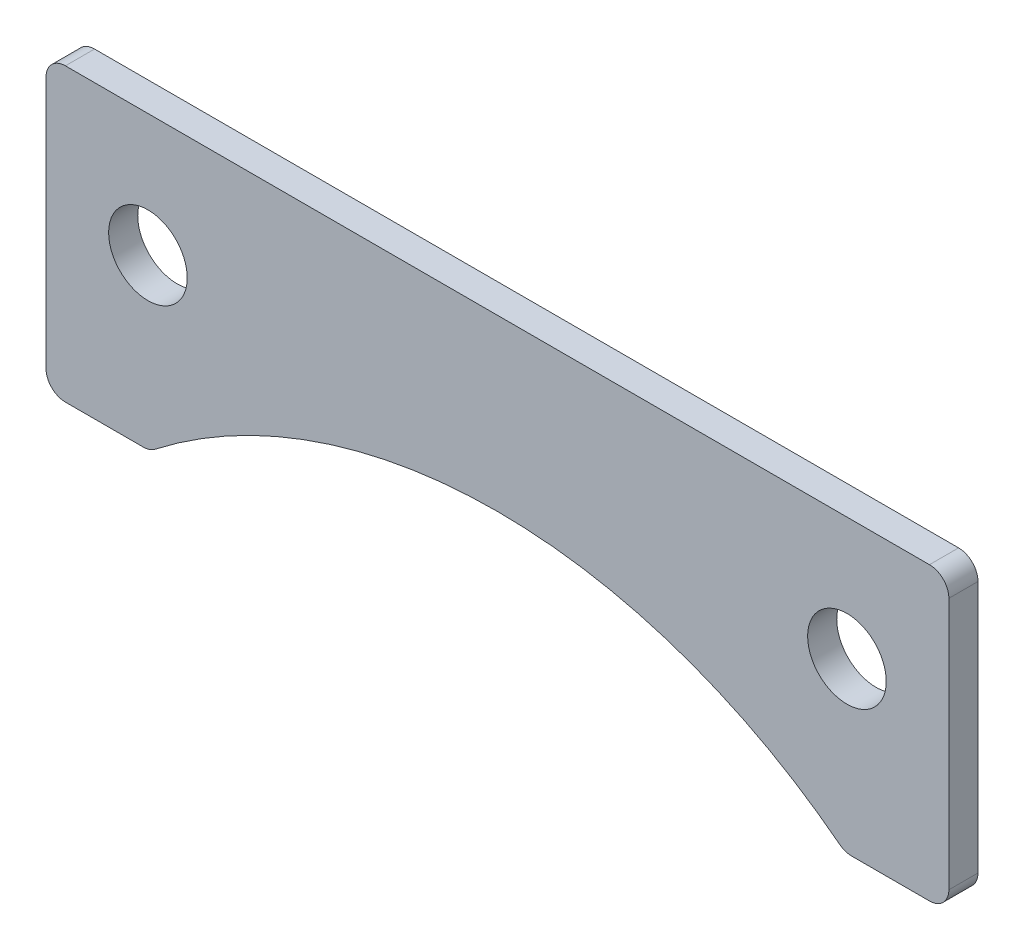
ISO-10303-21;
HEADER;
FILE_DESCRIPTION(('STEP AP214'),'2;1');
FILE_NAME('part.step','',(''),(''),'','','');
FILE_SCHEMA(('AUTOMOTIVE_DESIGN { 1 0 10303 214 1 1 1 1 }'));
ENDSEC;
DATA;
#1=APPLICATION_CONTEXT('core data for automotive mechanical design processes');
#2=APPLICATION_PROTOCOL_DEFINITION('international standard','automotive_design',2000,#1);
#3=PRODUCT_CONTEXT('',#1,'mechanical');
#4=PRODUCT('Part','Part','',(#3));
#5=PRODUCT_RELATED_PRODUCT_CATEGORY('part','',(#4));
#6=PRODUCT_DEFINITION_FORMATION('','',#4);
#7=PRODUCT_DEFINITION_CONTEXT('part definition',#1,'design');
#8=PRODUCT_DEFINITION('design','',#6,#7);
#9=PRODUCT_DEFINITION_SHAPE('','',#8);
#10=(LENGTH_UNIT() NAMED_UNIT(*) SI_UNIT(.MILLI.,.METRE.));
#11=(NAMED_UNIT(*) PLANE_ANGLE_UNIT() SI_UNIT($,.RADIAN.));
#12=(NAMED_UNIT(*) SI_UNIT($,.STERADIAN.) SOLID_ANGLE_UNIT());
#13=UNCERTAINTY_MEASURE_WITH_UNIT(LENGTH_MEASURE(1.E-05),#10,'distance_accuracy_value','');
#14=(GEOMETRIC_REPRESENTATION_CONTEXT(3) GLOBAL_UNCERTAINTY_ASSIGNED_CONTEXT((#13)) GLOBAL_UNIT_ASSIGNED_CONTEXT((#10,
#11,#12)) REPRESENTATION_CONTEXT('',''));
#15=CARTESIAN_POINT('',(0.,0.,0.));
#16=DIRECTION('',(0.,0.,1.));
#17=DIRECTION('',(1.,0.,0.));
#18=AXIS2_PLACEMENT_3D('',#15,#16,#17);
#19=CARTESIAN_POINT('',(0.,17.9426377775834,0.));
#20=DIRECTION('',(0.,0.,1.));
#21=DIRECTION('',(1.,0.,0.));
#22=AXIS2_PLACEMENT_3D('',#19,#20,#21);
#23=PLANE('',#22);
#24=CARTESIAN_POINT('',(36.,17.3538290724796,0.));
#25=DIRECTION('',(0.,0.,1.));
#26=DIRECTION('',(1.,0.,0.));
#27=AXIS2_PLACEMENT_3D('',#24,#25,#26);
#28=CIRCLE('',#27,4.05);
#29=CARTESIAN_POINT('',(31.95,17.3538290724796,0.));
#30=VERTEX_POINT('',#29);
#31=EDGE_CURVE('E40',#30,#30,#28,.T.);
#32=ORIENTED_EDGE('',*,*,#31,.T.);
#33=EDGE_LOOP('',(#32));
#34=FACE_BOUND('',#33,.T.);
#35=CARTESIAN_POINT('',(-36.,17.3538290724796,0.));
#36=DIRECTION('',(0.,0.,1.));
#37=DIRECTION('',(1.,0.,0.));
#38=AXIS2_PLACEMENT_3D('',#35,#36,#37);
#39=CIRCLE('',#38,4.05);
#40=CARTESIAN_POINT('',(-40.05,17.3538290724796,0.));
#41=VERTEX_POINT('',#40);
#42=EDGE_CURVE('E201',#41,#41,#39,.T.);
#43=ORIENTED_EDGE('',*,*,#42,.T.);
#44=EDGE_LOOP('',(#43));
#45=FACE_BOUND('',#44,.T.);
#46=CARTESIAN_POINT('',(-44.5,2.,0.));
#47=DIRECTION('',(0.,0.,1.));
#48=DIRECTION('',(-0.707106781186546,-0.707106781186549,0.));
#49=AXIS2_PLACEMENT_3D('',#46,#47,#48);
#50=CIRCLE('',#49,2.);
#51=CARTESIAN_POINT('',(-46.5,2.,0.));
#52=VERTEX_POINT('',#51);
#53=CARTESIAN_POINT('',(-44.5,0.,0.));
#54=VERTEX_POINT('',#53);
#55=EDGE_CURVE('E169',#52,#54,#50,.T.);
#56=ORIENTED_EDGE('',*,*,#55,.F.);
#57=DIRECTION('',(0.,1.,0.));
#58=VECTOR('',#57,1.);
#59=CARTESIAN_POINT('',(-46.5,0.,0.));
#60=LINE('',#59,#58);
#61=CARTESIAN_POINT('',(-46.5,28.,0.));
#62=VERTEX_POINT('',#61);
#63=EDGE_CURVE('E164',#52,#62,#60,.T.);
#64=ORIENTED_EDGE('',*,*,#63,.T.);
#65=CARTESIAN_POINT('',(-44.5,28.,0.));
#66=DIRECTION('',(0.,0.,1.));
#67=DIRECTION('',(-0.707106781186546,0.707106781186549,0.));
#68=AXIS2_PLACEMENT_3D('',#65,#66,#67);
#69=CIRCLE('',#68,2.);
#70=CARTESIAN_POINT('',(-44.5,30.,0.));
#71=VERTEX_POINT('',#70);
#72=EDGE_CURVE('E260',#71,#62,#69,.T.);
#73=ORIENTED_EDGE('',*,*,#72,.F.);
#74=DIRECTION('',(1.,0.,0.));
#75=VECTOR('',#74,1.);
#76=CARTESIAN_POINT('',(-46.5,30.,0.));
#77=LINE('',#76,#75);
#78=CARTESIAN_POINT('',(44.5,30.,0.));
#79=VERTEX_POINT('',#78);
#80=EDGE_CURVE('E270',#71,#79,#77,.T.);
#81=ORIENTED_EDGE('',*,*,#80,.T.);
#82=CARTESIAN_POINT('',(44.5,28.,0.));
#83=DIRECTION('',(0.,0.,1.));
#84=DIRECTION('',(0.707106781186546,0.707106781186549,0.));
#85=AXIS2_PLACEMENT_3D('',#82,#83,#84);
#86=CIRCLE('',#85,2.);
#87=CARTESIAN_POINT('',(46.5,28.,0.));
#88=VERTEX_POINT('',#87);
#89=EDGE_CURVE('E248',#88,#79,#86,.T.);
#90=ORIENTED_EDGE('',*,*,#89,.F.);
#91=DIRECTION('',(0.,-1.,0.));
#92=VECTOR('',#91,1.);
#93=CARTESIAN_POINT('',(46.5,30.,0.));
#94=LINE('',#93,#92);
#95=CARTESIAN_POINT('',(46.5,2.,0.));
#96=VERTEX_POINT('',#95);
#97=EDGE_CURVE('E243',#88,#96,#94,.T.);
#98=ORIENTED_EDGE('',*,*,#97,.T.);
#99=CARTESIAN_POINT('',(44.5,2.,0.));
#100=DIRECTION('',(0.,0.,1.));
#101=DIRECTION('',(0.707106781186549,-0.707106781186546,0.));
#102=AXIS2_PLACEMENT_3D('',#99,#100,#101);
#103=CIRCLE('',#102,2.);
#104=CARTESIAN_POINT('',(44.5,0.,0.));
#105=VERTEX_POINT('',#104);
#106=EDGE_CURVE('E241',#105,#96,#103,.T.);
#107=ORIENTED_EDGE('',*,*,#106,.F.);
#108=DIRECTION('',(-1.,0.,0.));
#109=VECTOR('',#108,1.);
#110=CARTESIAN_POINT('',(46.5,0.,0.));
#111=LINE('',#110,#109);
#112=CARTESIAN_POINT('',(36.4862987983161,0.,0.));
#113=VERTEX_POINT('',#112);
#114=EDGE_CURVE('E28',#105,#113,#111,.T.);
#115=ORIENTED_EDGE('',*,*,#114,.T.);
#116=CARTESIAN_POINT('',(36.4862987983161,2.,0.));
#117=DIRECTION('',(0.,0.,1.));
#118=DIRECTION('',(-0.324101861776083,-0.946022189588213,0.));
#119=AXIS2_PLACEMENT_3D('',#116,#117,#118);
#120=CIRCLE('',#119,2.);
#121=CARTESIAN_POINT('',(35.259868586608,0.420168067226889,0.));
#122=VERTEX_POINT('',#121);
#123=EDGE_CURVE('E259',#122,#113,#120,.T.);
#124=ORIENTED_EDGE('',*,*,#123,.F.);
#125=CARTESIAN_POINT('',(0.,-45.,0.));
#126=DIRECTION('',(0.,0.,1.));
#127=DIRECTION('',(0.622513959272885,0.782608695652174,0.));
#128=AXIS2_PLACEMENT_3D('',#125,#126,#127);
#129=CIRCLE('',#128,57.5);
#130=CARTESIAN_POINT('',(-35.2598685866079,0.420168067226898,0.));
#131=VERTEX_POINT('',#130);
#132=EDGE_CURVE('E21',#122,#131,#129,.T.);
#133=ORIENTED_EDGE('',*,*,#132,.T.);
#134=CARTESIAN_POINT('',(-36.486298798316,2.,0.));
#135=DIRECTION('',(0.,0.,1.));
#136=DIRECTION('',(0.324101861776081,-0.946022189588214,0.));
#137=AXIS2_PLACEMENT_3D('',#134,#135,#136);
#138=CIRCLE('',#137,2.);
#139=CARTESIAN_POINT('',(-36.486298798316,0.,0.));
#140=VERTEX_POINT('',#139);
#141=EDGE_CURVE('E231',#140,#131,#138,.T.);
#142=ORIENTED_EDGE('',*,*,#141,.F.);
#143=DIRECTION('',(-1.,0.,0.));
#144=VECTOR('',#143,1.);
#145=CARTESIAN_POINT('',(-35.7945526581909,0.,0.));
#146=LINE('',#145,#144);
#147=EDGE_CURVE('E11',#140,#54,#146,.T.);
#148=ORIENTED_EDGE('',*,*,#147,.T.);
#149=EDGE_LOOP('',(#56,#64,#73,#81,#90,#98,#107,#115,#124,#133,#142,#148));
#150=FACE_BOUND('',#149,.T.);
#151=ADVANCED_FACE('F17',(#34,#45,#150),#23,.F.);
#152=CARTESIAN_POINT('',(-46.5,0.,0.));
#153=DIRECTION('',(0.,-1.,0.));
#154=DIRECTION('',(0.,0.,-1.));
#155=AXIS2_PLACEMENT_3D('',#152,#153,#154);
#156=PLANE('',#155);
#157=DIRECTION('',(0.,0.,1.));
#158=VECTOR('',#157,1.);
#159=CARTESIAN_POINT('',(-44.5,0.,0.));
#160=LINE('',#159,#158);
#161=CARTESIAN_POINT('',(-44.5,0.,3.));
#162=VERTEX_POINT('',#161);
#163=EDGE_CURVE('E159',#54,#162,#160,.T.);
#164=ORIENTED_EDGE('',*,*,#163,.F.);
#165=ORIENTED_EDGE('',*,*,#147,.F.);
#166=DIRECTION('',(0.,0.,-1.));
#167=VECTOR('',#166,1.);
#168=CARTESIAN_POINT('',(-36.486298798316,0.,0.));
#169=LINE('',#168,#167);
#170=CARTESIAN_POINT('',(-36.486298798316,0.,3.));
#171=VERTEX_POINT('',#170);
#172=EDGE_CURVE('E196',#171,#140,#169,.T.);
#173=ORIENTED_EDGE('',*,*,#172,.F.);
#174=DIRECTION('',(1.,0.,0.));
#175=VECTOR('',#174,1.);
#176=CARTESIAN_POINT('',(-35.7945526581909,0.,3.));
#177=LINE('',#176,#175);
#178=EDGE_CURVE('E191',#162,#171,#177,.T.);
#179=ORIENTED_EDGE('',*,*,#178,.F.);
#180=EDGE_LOOP('',(#164,#165,#173,#179));
#181=FACE_BOUND('',#180,.T.);
#182=ADVANCED_FACE('F337',(#181),#156,.T.);
#183=CARTESIAN_POINT('',(35.7945526581909,0.,0.));
#184=DIRECTION('',(0.,-1.,0.));
#185=DIRECTION('',(0.,0.,-1.));
#186=AXIS2_PLACEMENT_3D('',#183,#184,#185);
#187=PLANE('',#186);
#188=DIRECTION('',(0.,0.,1.));
#189=VECTOR('',#188,1.);
#190=CARTESIAN_POINT('',(36.4862987983161,0.,0.));
#191=LINE('',#190,#189);
#192=CARTESIAN_POINT('',(36.4862987983161,0.,3.));
#193=VERTEX_POINT('',#192);
#194=EDGE_CURVE('E242',#113,#193,#191,.T.);
#195=ORIENTED_EDGE('',*,*,#194,.F.);
#196=ORIENTED_EDGE('',*,*,#114,.F.);
#197=DIRECTION('',(0.,0.,-1.));
#198=VECTOR('',#197,1.);
#199=CARTESIAN_POINT('',(44.5,0.,0.));
#200=LINE('',#199,#198);
#201=CARTESIAN_POINT('',(44.5,0.,3.));
#202=VERTEX_POINT('',#201);
#203=EDGE_CURVE('E238',#202,#105,#200,.T.);
#204=ORIENTED_EDGE('',*,*,#203,.F.);
#205=DIRECTION('',(1.,0.,0.));
#206=VECTOR('',#205,1.);
#207=CARTESIAN_POINT('',(46.5,0.,3.));
#208=LINE('',#207,#206);
#209=EDGE_CURVE('E187',#193,#202,#208,.T.);
#210=ORIENTED_EDGE('',*,*,#209,.F.);
#211=EDGE_LOOP('',(#195,#196,#204,#210));
#212=FACE_BOUND('',#211,.T.);
#213=ADVANCED_FACE('F342',(#212),#187,.T.);
#214=CARTESIAN_POINT('',(46.5,30.,0.));
#215=DIRECTION('',(0.,1.,0.));
#216=DIRECTION('',(1.,0.,0.));
#217=AXIS2_PLACEMENT_3D('',#214,#215,#216);
#218=PLANE('',#217);
#219=DIRECTION('',(0.,0.,1.));
#220=VECTOR('',#219,1.);
#221=CARTESIAN_POINT('',(44.5,30.,0.));
#222=LINE('',#221,#220);
#223=CARTESIAN_POINT('',(44.5,30.,3.));
#224=VERTEX_POINT('',#223);
#225=EDGE_CURVE('E252',#79,#224,#222,.T.);
#226=ORIENTED_EDGE('',*,*,#225,.F.);
#227=ORIENTED_EDGE('',*,*,#80,.F.);
#228=DIRECTION('',(0.,0.,-1.));
#229=VECTOR('',#228,1.);
#230=CARTESIAN_POINT('',(-44.5,30.,0.));
#231=LINE('',#230,#229);
#232=CARTESIAN_POINT('',(-44.5,30.,3.));
#233=VERTEX_POINT('',#232);
#234=EDGE_CURVE('E264',#233,#71,#231,.T.);
#235=ORIENTED_EDGE('',*,*,#234,.F.);
#236=DIRECTION('',(-1.,0.,0.));
#237=VECTOR('',#236,1.);
#238=CARTESIAN_POINT('',(-46.5,30.,3.));
#239=LINE('',#238,#237);
#240=EDGE_CURVE('E202',#224,#233,#239,.T.);
#241=ORIENTED_EDGE('',*,*,#240,.F.);
#242=EDGE_LOOP('',(#226,#227,#235,#241));
#243=FACE_BOUND('',#242,.T.);
#244=ADVANCED_FACE('F348',(#243),#218,.T.);
#245=CARTESIAN_POINT('',(36.,17.3538290724796,-94.765024420802));
#246=DIRECTION('',(0.,0.,1.));
#247=DIRECTION('',(1.,0.,0.));
#248=AXIS2_PLACEMENT_3D('',#245,#246,#247);
#249=CYLINDRICAL_SURFACE('',#248,4.05);
#250=CARTESIAN_POINT('',(36.,17.3538290724796,3.));
#251=DIRECTION('',(0.,0.,-1.));
#252=DIRECTION('',(1.,0.,0.));
#253=AXIS2_PLACEMENT_3D('',#250,#251,#252);
#254=CIRCLE('',#253,4.05);
#255=CARTESIAN_POINT('',(31.95,17.3538290724796,3.));
#256=VERTEX_POINT('',#255);
#257=EDGE_CURVE('E192',#256,#256,#254,.T.);
#258=ORIENTED_EDGE('',*,*,#257,.F.);
#259=DIRECTION('',(0.,0.,-1.));
#260=VECTOR('',#259,1.);
#261=CARTESIAN_POINT('',(31.95,17.3538290724796,-94.765024420802));
#262=LINE('',#261,#260);
#263=EDGE_CURVE('E197',#256,#30,#262,.T.);
#264=ORIENTED_EDGE('',*,*,#263,.T.);
#265=ORIENTED_EDGE('',*,*,#31,.F.);
#266=ORIENTED_EDGE('',*,*,#263,.F.);
#267=EDGE_LOOP('',(#258,#264,#265,#266));
#268=FACE_BOUND('',#267,.T.);
#269=ADVANCED_FACE('F351',(#268),#249,.F.);
#270=CARTESIAN_POINT('',(-36.,17.3538290724796,-94.765024420802));
#271=DIRECTION('',(0.,0.,1.));
#272=DIRECTION('',(1.,0.,0.));
#273=AXIS2_PLACEMENT_3D('',#270,#271,#272);
#274=CYLINDRICAL_SURFACE('',#273,4.05);
#275=CARTESIAN_POINT('',(-36.,17.3538290724796,3.));
#276=DIRECTION('',(0.,0.,-1.));
#277=DIRECTION('',(1.,0.,0.));
#278=AXIS2_PLACEMENT_3D('',#275,#276,#277);
#279=CIRCLE('',#278,4.05);
#280=CARTESIAN_POINT('',(-40.05,17.3538290724796,3.));
#281=VERTEX_POINT('',#280);
#282=EDGE_CURVE('E181',#281,#281,#279,.T.);
#283=ORIENTED_EDGE('',*,*,#282,.F.);
#284=DIRECTION('',(0.,0.,-1.));
#285=VECTOR('',#284,1.);
#286=CARTESIAN_POINT('',(-40.05,17.3538290724796,-94.765024420802));
#287=LINE('',#286,#285);
#288=EDGE_CURVE('E263',#281,#41,#287,.T.);
#289=ORIENTED_EDGE('',*,*,#288,.T.);
#290=ORIENTED_EDGE('',*,*,#42,.F.);
#291=ORIENTED_EDGE('',*,*,#288,.F.);
#292=EDGE_LOOP('',(#283,#289,#290,#291));
#293=FACE_BOUND('',#292,.T.);
#294=ADVANCED_FACE('F363',(#293),#274,.F.);
#295=CARTESIAN_POINT('',(-44.5,28.,0.));
#296=DIRECTION('',(0.,0.,1.));
#297=DIRECTION('',(-0.707106781186546,0.707106781186549,0.));
#298=AXIS2_PLACEMENT_3D('',#295,#296,#297);
#299=CYLINDRICAL_SURFACE('',#298,2.);
#300=CARTESIAN_POINT('',(-44.5,28.,3.));
#301=DIRECTION('',(0.,0.,-1.));
#302=DIRECTION('',(-0.707106781186546,0.707106781186549,0.));
#303=AXIS2_PLACEMENT_3D('',#300,#301,#302);
#304=CIRCLE('',#303,2.);
#305=CARTESIAN_POINT('',(-46.5,28.,3.));
#306=VERTEX_POINT('',#305);
#307=EDGE_CURVE('E153',#306,#233,#304,.T.);
#308=ORIENTED_EDGE('',*,*,#307,.T.);
#309=ORIENTED_EDGE('',*,*,#234,.T.);
#310=ORIENTED_EDGE('',*,*,#72,.T.);
#311=DIRECTION('',(0.,0.,1.));
#312=VECTOR('',#311,1.);
#313=CARTESIAN_POINT('',(-46.5,28.,0.));
#314=LINE('',#313,#312);
#315=EDGE_CURVE('E158',#62,#306,#314,.T.);
#316=ORIENTED_EDGE('',*,*,#315,.T.);
#317=EDGE_LOOP('',(#308,#309,#310,#316));
#318=FACE_BOUND('',#317,.T.);
#319=ADVANCED_FACE('F359',(#318),#299,.T.);
#320=CARTESIAN_POINT('',(44.5,28.,0.));
#321=DIRECTION('',(0.,0.,1.));
#322=DIRECTION('',(0.707106781186546,0.707106781186549,0.));
#323=AXIS2_PLACEMENT_3D('',#320,#321,#322);
#324=CYLINDRICAL_SURFACE('',#323,2.);
#325=CARTESIAN_POINT('',(44.5,28.,3.));
#326=DIRECTION('',(0.,0.,-1.));
#327=DIRECTION('',(0.707106781186546,0.707106781186549,0.));
#328=AXIS2_PLACEMENT_3D('',#325,#326,#327);
#329=CIRCLE('',#328,2.);
#330=CARTESIAN_POINT('',(46.5,28.,3.));
#331=VERTEX_POINT('',#330);
#332=EDGE_CURVE('E205',#224,#331,#329,.T.);
#333=ORIENTED_EDGE('',*,*,#332,.T.);
#334=DIRECTION('',(0.,0.,-1.));
#335=VECTOR('',#334,1.);
#336=CARTESIAN_POINT('',(46.5,28.,0.));
#337=LINE('',#336,#335);
#338=EDGE_CURVE('E246',#331,#88,#337,.T.);
#339=ORIENTED_EDGE('',*,*,#338,.T.);
#340=ORIENTED_EDGE('',*,*,#89,.T.);
#341=ORIENTED_EDGE('',*,*,#225,.T.);
#342=EDGE_LOOP('',(#333,#339,#340,#341));
#343=FACE_BOUND('',#342,.T.);
#344=ADVANCED_FACE('F355',(#343),#324,.T.);
#345=CARTESIAN_POINT('',(46.5,0.,0.));
#346=DIRECTION('',(1.,0.,0.));
#347=DIRECTION('',(0.,1.,0.));
#348=AXIS2_PLACEMENT_3D('',#345,#346,#347);
#349=PLANE('',#348);
#350=DIRECTION('',(0.,0.,1.));
#351=VECTOR('',#350,1.);
#352=CARTESIAN_POINT('',(46.5,2.,0.));
#353=LINE('',#352,#351);
#354=CARTESIAN_POINT('',(46.5,2.,3.));
#355=VERTEX_POINT('',#354);
#356=EDGE_CURVE('E247',#96,#355,#353,.T.);
#357=ORIENTED_EDGE('',*,*,#356,.F.);
#358=ORIENTED_EDGE('',*,*,#97,.F.);
#359=ORIENTED_EDGE('',*,*,#338,.F.);
#360=DIRECTION('',(0.,1.,0.));
#361=VECTOR('',#360,1.);
#362=CARTESIAN_POINT('',(46.5,30.,3.));
#363=LINE('',#362,#361);
#364=EDGE_CURVE('E206',#355,#331,#363,.T.);
#365=ORIENTED_EDGE('',*,*,#364,.F.);
#366=EDGE_LOOP('',(#357,#358,#359,#365));
#367=FACE_BOUND('',#366,.T.);
#368=ADVANCED_FACE('F333',(#367),#349,.T.);
#369=CARTESIAN_POINT('',(44.5,2.,0.));
#370=DIRECTION('',(0.,0.,1.));
#371=DIRECTION('',(0.707106781186549,-0.707106781186546,0.));
#372=AXIS2_PLACEMENT_3D('',#369,#370,#371);
#373=CYLINDRICAL_SURFACE('',#372,2.);
#374=CARTESIAN_POINT('',(44.5,2.,3.));
#375=DIRECTION('',(0.,0.,-1.));
#376=DIRECTION('',(0.707106781186549,-0.707106781186546,0.));
#377=AXIS2_PLACEMENT_3D('',#374,#375,#376);
#378=CIRCLE('',#377,2.);
#379=EDGE_CURVE('E210',#355,#202,#378,.T.);
#380=ORIENTED_EDGE('',*,*,#379,.T.);
#381=ORIENTED_EDGE('',*,*,#203,.T.);
#382=ORIENTED_EDGE('',*,*,#106,.T.);
#383=ORIENTED_EDGE('',*,*,#356,.T.);
#384=EDGE_LOOP('',(#380,#381,#382,#383));
#385=FACE_BOUND('',#384,.T.);
#386=ADVANCED_FACE('F324',(#385),#373,.T.);
#387=CARTESIAN_POINT('',(36.4862987983161,2.,0.));
#388=DIRECTION('',(0.,0.,1.));
#389=DIRECTION('',(-0.324101861776083,-0.946022189588213,0.));
#390=AXIS2_PLACEMENT_3D('',#387,#388,#389);
#391=CYLINDRICAL_SURFACE('',#390,2.);
#392=CARTESIAN_POINT('',(36.4862987983161,2.,3.));
#393=DIRECTION('',(0.,0.,-1.));
#394=DIRECTION('',(-0.324101861776083,-0.946022189588213,0.));
#395=AXIS2_PLACEMENT_3D('',#392,#393,#394);
#396=CIRCLE('',#395,2.);
#397=CARTESIAN_POINT('',(35.259868586608,0.420168067226889,3.));
#398=VERTEX_POINT('',#397);
#399=EDGE_CURVE('E183',#193,#398,#396,.T.);
#400=ORIENTED_EDGE('',*,*,#399,.T.);
#401=DIRECTION('',(0.,0.,-1.));
#402=VECTOR('',#401,1.);
#403=CARTESIAN_POINT('',(35.259868586608,0.420168067226889,0.));
#404=LINE('',#403,#402);
#405=EDGE_CURVE('E255',#398,#122,#404,.T.);
#406=ORIENTED_EDGE('',*,*,#405,.T.);
#407=ORIENTED_EDGE('',*,*,#123,.T.);
#408=ORIENTED_EDGE('',*,*,#194,.T.);
#409=EDGE_LOOP('',(#400,#406,#407,#408));
#410=FACE_BOUND('',#409,.T.);
#411=ADVANCED_FACE('F322',(#410),#391,.T.);
#412=CARTESIAN_POINT('',(0.,-45.,0.));
#413=DIRECTION('',(0.,0.,1.));
#414=DIRECTION('',(0.622513959272885,0.782608695652174,0.));
#415=AXIS2_PLACEMENT_3D('',#412,#413,#414);
#416=CYLINDRICAL_SURFACE('',#415,57.5);
#417=DIRECTION('',(0.,0.,1.));
#418=VECTOR('',#417,1.);
#419=CARTESIAN_POINT('',(-35.2598685866079,0.420168067226898,0.));
#420=LINE('',#419,#418);
#421=CARTESIAN_POINT('',(-35.2598685866079,0.420168067226898,3.));
#422=VERTEX_POINT('',#421);
#423=EDGE_CURVE('E235',#131,#422,#420,.T.);
#424=ORIENTED_EDGE('',*,*,#423,.F.);
#425=ORIENTED_EDGE('',*,*,#132,.F.);
#426=ORIENTED_EDGE('',*,*,#405,.F.);
#427=CARTESIAN_POINT('',(0.,-45.,3.));
#428=DIRECTION('',(0.,0.,-1.));
#429=DIRECTION('',(0.622513959272885,0.782608695652174,0.));
#430=AXIS2_PLACEMENT_3D('',#427,#428,#429);
#431=CIRCLE('',#430,57.5);
#432=EDGE_CURVE('E188',#422,#398,#431,.T.);
#433=ORIENTED_EDGE('',*,*,#432,.F.);
#434=EDGE_LOOP('',(#424,#425,#426,#433));
#435=FACE_BOUND('',#434,.T.);
#436=ADVANCED_FACE('F320',(#435),#416,.F.);
#437=CARTESIAN_POINT('',(-36.486298798316,2.,0.));
#438=DIRECTION('',(0.,0.,1.));
#439=DIRECTION('',(0.324101861776081,-0.946022189588214,0.));
#440=AXIS2_PLACEMENT_3D('',#437,#438,#439);
#441=CYLINDRICAL_SURFACE('',#440,2.);
#442=CARTESIAN_POINT('',(-36.486298798316,2.,3.));
#443=DIRECTION('',(0.,0.,-1.));
#444=DIRECTION('',(0.324101861776081,-0.946022189588214,0.));
#445=AXIS2_PLACEMENT_3D('',#442,#443,#444);
#446=CIRCLE('',#445,2.);
#447=EDGE_CURVE('E278',#422,#171,#446,.T.);
#448=ORIENTED_EDGE('',*,*,#447,.T.);
#449=ORIENTED_EDGE('',*,*,#172,.T.);
#450=ORIENTED_EDGE('',*,*,#141,.T.);
#451=ORIENTED_EDGE('',*,*,#423,.T.);
#452=EDGE_LOOP('',(#448,#449,#450,#451));
#453=FACE_BOUND('',#452,.T.);
#454=ADVANCED_FACE('F331',(#453),#441,.T.);
#455=CARTESIAN_POINT('',(0.,17.9426377775834,3.));
#456=DIRECTION('',(0.,0.,1.));
#457=DIRECTION('',(1.,0.,0.));
#458=AXIS2_PLACEMENT_3D('',#455,#456,#457);
#459=PLANE('',#458);
#460=ORIENTED_EDGE('',*,*,#257,.T.);
#461=EDGE_LOOP('',(#460));
#462=FACE_BOUND('',#461,.T.);
#463=ORIENTED_EDGE('',*,*,#282,.T.);
#464=EDGE_LOOP('',(#463));
#465=FACE_BOUND('',#464,.T.);
#466=CARTESIAN_POINT('',(-44.5,2.,3.));
#467=DIRECTION('',(0.,0.,-1.));
#468=DIRECTION('',(-0.707106781186546,-0.707106781186549,0.));
#469=AXIS2_PLACEMENT_3D('',#466,#467,#468);
#470=CIRCLE('',#469,2.);
#471=CARTESIAN_POINT('',(-46.5,2.,3.));
#472=VERTEX_POINT('',#471);
#473=EDGE_CURVE('E150',#162,#472,#470,.T.);
#474=ORIENTED_EDGE('',*,*,#473,.F.);
#475=ORIENTED_EDGE('',*,*,#178,.T.);
#476=ORIENTED_EDGE('',*,*,#447,.F.);
#477=ORIENTED_EDGE('',*,*,#432,.T.);
#478=ORIENTED_EDGE('',*,*,#399,.F.);
#479=ORIENTED_EDGE('',*,*,#209,.T.);
#480=ORIENTED_EDGE('',*,*,#379,.F.);
#481=ORIENTED_EDGE('',*,*,#364,.T.);
#482=ORIENTED_EDGE('',*,*,#332,.F.);
#483=ORIENTED_EDGE('',*,*,#240,.T.);
#484=ORIENTED_EDGE('',*,*,#307,.F.);
#485=DIRECTION('',(0.,-1.,0.));
#486=VECTOR('',#485,1.);
#487=CARTESIAN_POINT('',(-46.5,0.,3.));
#488=LINE('',#487,#486);
#489=EDGE_CURVE('E145',#306,#472,#488,.T.);
#490=ORIENTED_EDGE('',*,*,#489,.T.);
#491=EDGE_LOOP('',(#474,#475,#476,#477,#478,#479,#480,#481,#482,#483,#484,#490));
#492=FACE_BOUND('',#491,.T.);
#493=ADVANCED_FACE('F147',(#462,#465,#492),#459,.T.);
#494=CARTESIAN_POINT('',(-46.5,30.,0.));
#495=DIRECTION('',(-1.,0.,0.));
#496=DIRECTION('',(0.,0.,1.));
#497=AXIS2_PLACEMENT_3D('',#494,#495,#496);
#498=PLANE('',#497);
#499=DIRECTION('',(0.,0.,-1.));
#500=VECTOR('',#499,1.);
#501=CARTESIAN_POINT('',(-46.5,2.,0.));
#502=LINE('',#501,#500);
#503=EDGE_CURVE('E162',#472,#52,#502,.T.);
#504=ORIENTED_EDGE('',*,*,#503,.F.);
#505=ORIENTED_EDGE('',*,*,#489,.F.);
#506=ORIENTED_EDGE('',*,*,#315,.F.);
#507=ORIENTED_EDGE('',*,*,#63,.F.);
#508=EDGE_LOOP('',(#504,#505,#506,#507));
#509=FACE_BOUND('',#508,.T.);
#510=ADVANCED_FACE('F19',(#509),#498,.T.);
#511=CARTESIAN_POINT('',(-44.5,2.,0.));
#512=DIRECTION('',(0.,0.,1.));
#513=DIRECTION('',(-0.707106781186546,-0.707106781186549,0.));
#514=AXIS2_PLACEMENT_3D('',#511,#512,#513);
#515=CYLINDRICAL_SURFACE('',#514,2.);
#516=ORIENTED_EDGE('',*,*,#473,.T.);
#517=ORIENTED_EDGE('',*,*,#503,.T.);
#518=ORIENTED_EDGE('',*,*,#55,.T.);
#519=ORIENTED_EDGE('',*,*,#163,.T.);
#520=EDGE_LOOP('',(#516,#517,#518,#519));
#521=FACE_BOUND('',#520,.T.);
#522=ADVANCED_FACE('F172',(#521),#515,.T.);
#523=CLOSED_SHELL('',(#151,#182,#213,#244,#269,#294,#319,#344,#368,#386,#411,#436,#454,#493,
#510,#522));
#524=MANIFOLD_SOLID_BREP('B1',#523);
#525=ADVANCED_BREP_SHAPE_REPRESENTATION('',(#18,#524),#14);
#526=SHAPE_DEFINITION_REPRESENTATION(#9,#525);
ENDSEC;
END-ISO-10303-21;
